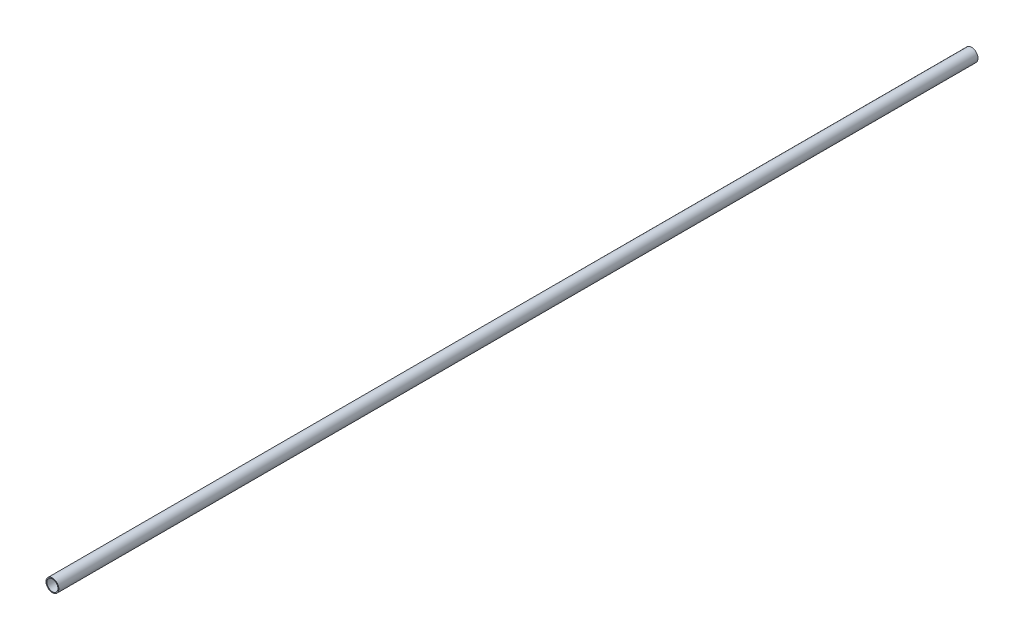
ISO-10303-21;
HEADER;
FILE_DESCRIPTION(('STEP AP214'),'2;1');
FILE_NAME('part.step','',(''),(''),'','','');
FILE_SCHEMA(('AUTOMOTIVE_DESIGN { 1 0 10303 214 1 1 1 1 }'));
ENDSEC;
DATA;
#1=APPLICATION_CONTEXT('core data for automotive mechanical design processes');
#2=APPLICATION_PROTOCOL_DEFINITION('international standard','automotive_design',2000,#1);
#3=PRODUCT_CONTEXT('',#1,'mechanical');
#4=PRODUCT('Part','Part','',(#3));
#5=PRODUCT_RELATED_PRODUCT_CATEGORY('part','',(#4));
#6=PRODUCT_DEFINITION_FORMATION('','',#4);
#7=PRODUCT_DEFINITION_CONTEXT('part definition',#1,'design');
#8=PRODUCT_DEFINITION('design','',#6,#7);
#9=PRODUCT_DEFINITION_SHAPE('','',#8);
#10=(LENGTH_UNIT() NAMED_UNIT(*) SI_UNIT(.MILLI.,.METRE.));
#11=(NAMED_UNIT(*) PLANE_ANGLE_UNIT() SI_UNIT($,.RADIAN.));
#12=(NAMED_UNIT(*) SI_UNIT($,.STERADIAN.) SOLID_ANGLE_UNIT());
#13=UNCERTAINTY_MEASURE_WITH_UNIT(LENGTH_MEASURE(1.E-05),#10,'distance_accuracy_value','');
#14=(GEOMETRIC_REPRESENTATION_CONTEXT(3) GLOBAL_UNCERTAINTY_ASSIGNED_CONTEXT((#13)) GLOBAL_UNIT_ASSIGNED_CONTEXT((#10,
#11,#12)) REPRESENTATION_CONTEXT('',''));
#15=CARTESIAN_POINT('',(0.,0.,0.));
#16=DIRECTION('',(0.,0.,1.));
#17=DIRECTION('',(1.,0.,0.));
#18=AXIS2_PLACEMENT_3D('',#15,#16,#17);
#19=CARTESIAN_POINT('',(0.,0.,500.));
#20=DIRECTION('',(0.,0.,1.));
#21=DIRECTION('',(1.,0.,0.));
#22=AXIS2_PLACEMENT_3D('',#19,#20,#21);
#23=PLANE('',#22);
#24=CARTESIAN_POINT('',(0.,0.,500.));
#25=DIRECTION('',(0.,0.,1.));
#26=DIRECTION('',(1.,0.,0.));
#27=AXIS2_PLACEMENT_3D('',#24,#25,#26);
#28=CIRCLE('',#27,7.);
#29=CARTESIAN_POINT('',(7.,0.,500.));
#30=VERTEX_POINT('',#29);
#31=EDGE_CURVE('E10',#30,#30,#28,.T.);
#32=ORIENTED_EDGE('',*,*,#31,.T.);
#33=EDGE_LOOP('',(#32));
#34=FACE_BOUND('',#33,.T.);
#35=CARTESIAN_POINT('',(0.,0.,500.));
#36=DIRECTION('',(0.,0.,1.));
#37=DIRECTION('',(1.,0.,0.));
#38=AXIS2_PLACEMENT_3D('',#35,#36,#37);
#39=CIRCLE('',#38,6.);
#40=CARTESIAN_POINT('',(6.,0.,500.));
#41=VERTEX_POINT('',#40);
#42=EDGE_CURVE('E50',#41,#41,#39,.T.);
#43=ORIENTED_EDGE('',*,*,#42,.F.);
#44=EDGE_LOOP('',(#43));
#45=FACE_BOUND('',#44,.T.);
#46=ADVANCED_FACE('F37',(#34,#45),#23,.T.);
#47=CARTESIAN_POINT('',(0.,0.,-500.));
#48=DIRECTION('',(0.,0.,1.));
#49=DIRECTION('',(1.,0.,0.));
#50=AXIS2_PLACEMENT_3D('',#47,#48,#49);
#51=PLANE('',#50);
#52=CARTESIAN_POINT('',(0.,0.,-500.));
#53=DIRECTION('',(0.,0.,1.));
#54=DIRECTION('',(1.,0.,0.));
#55=AXIS2_PLACEMENT_3D('',#52,#53,#54);
#56=CIRCLE('',#55,7.);
#57=CARTESIAN_POINT('',(7.,0.,-500.));
#58=VERTEX_POINT('',#57);
#59=EDGE_CURVE('E41',#58,#58,#56,.T.);
#60=ORIENTED_EDGE('',*,*,#59,.F.);
#61=EDGE_LOOP('',(#60));
#62=FACE_BOUND('',#61,.T.);
#63=CARTESIAN_POINT('',(0.,0.,-500.));
#64=DIRECTION('',(0.,0.,1.));
#65=DIRECTION('',(1.,0.,0.));
#66=AXIS2_PLACEMENT_3D('',#63,#64,#65);
#67=CIRCLE('',#66,6.);
#68=CARTESIAN_POINT('',(6.,0.,-500.));
#69=VERTEX_POINT('',#68);
#70=EDGE_CURVE('E52',#69,#69,#67,.T.);
#71=ORIENTED_EDGE('',*,*,#70,.T.);
#72=EDGE_LOOP('',(#71));
#73=FACE_BOUND('',#72,.T.);
#74=ADVANCED_FACE('F64',(#62,#73),#51,.F.);
#75=CARTESIAN_POINT('',(0.,0.,500.));
#76=DIRECTION('',(0.,0.,-1.));
#77=DIRECTION('',(-1.,0.,0.));
#78=AXIS2_PLACEMENT_3D('',#75,#76,#77);
#79=CYLINDRICAL_SURFACE('',#78,7.);
#80=ORIENTED_EDGE('',*,*,#31,.F.);
#81=EDGE_LOOP('',(#80));
#82=FACE_BOUND('',#81,.T.);
#83=ORIENTED_EDGE('',*,*,#59,.T.);
#84=EDGE_LOOP('',(#83));
#85=FACE_BOUND('',#84,.T.);
#86=ADVANCED_FACE('F39',(#82,#85),#79,.T.);
#87=CARTESIAN_POINT('',(0.,0.,500.));
#88=DIRECTION('',(0.,0.,-1.));
#89=DIRECTION('',(-1.,0.,0.));
#90=AXIS2_PLACEMENT_3D('',#87,#88,#89);
#91=CYLINDRICAL_SURFACE('',#90,6.);
#92=ORIENTED_EDGE('',*,*,#42,.T.);
#93=EDGE_LOOP('',(#92));
#94=FACE_BOUND('',#93,.T.);
#95=ORIENTED_EDGE('',*,*,#70,.F.);
#96=EDGE_LOOP('',(#95));
#97=FACE_BOUND('',#96,.T.);
#98=ADVANCED_FACE('F60',(#94,#97),#91,.F.);
#99=CLOSED_SHELL('',(#46,#74,#86,#98));
#100=MANIFOLD_SOLID_BREP('B2',#99);
#101=ADVANCED_BREP_SHAPE_REPRESENTATION('',(#18,#100),#14);
#102=SHAPE_DEFINITION_REPRESENTATION(#9,#101);
ENDSEC;
END-ISO-10303-21;
